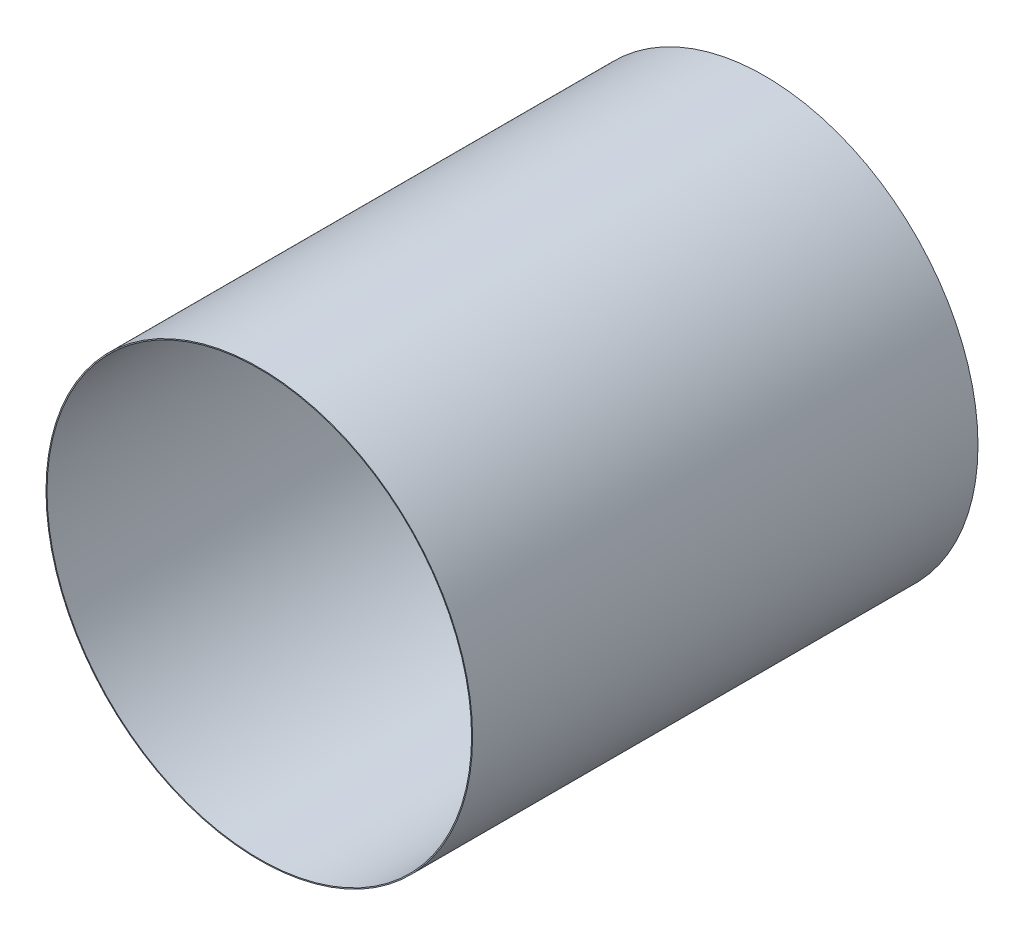
ISO-10303-21;
HEADER;
FILE_DESCRIPTION(('STEP AP214'),'2;1');
FILE_NAME('part.step','',(''),(''),'','','');
FILE_SCHEMA(('AUTOMOTIVE_DESIGN { 1 0 10303 214 1 1 1 1 }'));
ENDSEC;
DATA;
#1=APPLICATION_CONTEXT('core data for automotive mechanical design processes');
#2=APPLICATION_PROTOCOL_DEFINITION('international standard','automotive_design',2000,#1);
#3=PRODUCT_CONTEXT('',#1,'mechanical');
#4=PRODUCT('Part','Part','',(#3));
#5=PRODUCT_RELATED_PRODUCT_CATEGORY('part','',(#4));
#6=PRODUCT_DEFINITION_FORMATION('','',#4);
#7=PRODUCT_DEFINITION_CONTEXT('part definition',#1,'design');
#8=PRODUCT_DEFINITION('design','',#6,#7);
#9=PRODUCT_DEFINITION_SHAPE('','',#8);
#10=(LENGTH_UNIT() NAMED_UNIT(*) SI_UNIT(.MILLI.,.METRE.));
#11=(NAMED_UNIT(*) PLANE_ANGLE_UNIT() SI_UNIT($,.RADIAN.));
#12=(NAMED_UNIT(*) SI_UNIT($,.STERADIAN.) SOLID_ANGLE_UNIT());
#13=UNCERTAINTY_MEASURE_WITH_UNIT(LENGTH_MEASURE(1.E-05),#10,'distance_accuracy_value','');
#14=(GEOMETRIC_REPRESENTATION_CONTEXT(3) GLOBAL_UNCERTAINTY_ASSIGNED_CONTEXT((#13)) GLOBAL_UNIT_ASSIGNED_CONTEXT((#10,
#11,#12)) REPRESENTATION_CONTEXT('',''));
#15=CARTESIAN_POINT('',(0.,0.,0.));
#16=DIRECTION('',(0.,0.,1.));
#17=DIRECTION('',(1.,0.,0.));
#18=AXIS2_PLACEMENT_3D('',#15,#16,#17);
#19=CARTESIAN_POINT('',(0.,0.,25.));
#20=DIRECTION('',(0.,0.,1.));
#21=DIRECTION('',(1.,0.,0.));
#22=AXIS2_PLACEMENT_3D('',#19,#20,#21);
#23=PLANE('',#22);
#24=CARTESIAN_POINT('',(0.,0.,25.));
#25=DIRECTION('',(0.,0.,1.));
#26=DIRECTION('',(1.,0.,0.));
#27=AXIS2_PLACEMENT_3D('',#24,#25,#26);
#28=CIRCLE('',#27,10.55);
#29=CARTESIAN_POINT('',(10.55,0.,25.));
#30=VERTEX_POINT('',#29);
#31=EDGE_CURVE('E10',#30,#30,#28,.T.);
#32=ORIENTED_EDGE('',*,*,#31,.T.);
#33=EDGE_LOOP('',(#32));
#34=FACE_BOUND('',#33,.T.);
#35=CARTESIAN_POINT('',(0.,0.,25.));
#36=DIRECTION('',(0.,0.,1.));
#37=DIRECTION('',(1.,0.,0.));
#38=AXIS2_PLACEMENT_3D('',#35,#36,#37);
#39=CIRCLE('',#38,10.5);
#40=CARTESIAN_POINT('',(10.5,0.,25.));
#41=VERTEX_POINT('',#40);
#42=EDGE_CURVE('E42',#41,#41,#39,.T.);
#43=ORIENTED_EDGE('',*,*,#42,.F.);
#44=EDGE_LOOP('',(#43));
#45=FACE_BOUND('',#44,.T.);
#46=ADVANCED_FACE('F31',(#34,#45),#23,.T.);
#47=CARTESIAN_POINT('',(0.,0.,0.));
#48=DIRECTION('',(0.,0.,1.));
#49=DIRECTION('',(1.,0.,0.));
#50=AXIS2_PLACEMENT_3D('',#47,#48,#49);
#51=PLANE('',#50);
#52=CARTESIAN_POINT('',(0.,0.,0.));
#53=DIRECTION('',(0.,0.,1.));
#54=DIRECTION('',(1.,0.,0.));
#55=AXIS2_PLACEMENT_3D('',#52,#53,#54);
#56=CIRCLE('',#55,10.55);
#57=CARTESIAN_POINT('',(10.55,0.,0.));
#58=VERTEX_POINT('',#57);
#59=EDGE_CURVE('E35',#58,#58,#56,.T.);
#60=ORIENTED_EDGE('',*,*,#59,.F.);
#61=EDGE_LOOP('',(#60));
#62=FACE_BOUND('',#61,.T.);
#63=CARTESIAN_POINT('',(0.,0.,0.));
#64=DIRECTION('',(0.,0.,1.));
#65=DIRECTION('',(1.,0.,0.));
#66=AXIS2_PLACEMENT_3D('',#63,#64,#65);
#67=CIRCLE('',#66,10.5);
#68=CARTESIAN_POINT('',(10.5,0.,0.));
#69=VERTEX_POINT('',#68);
#70=EDGE_CURVE('E44',#69,#69,#67,.T.);
#71=ORIENTED_EDGE('',*,*,#70,.T.);
#72=EDGE_LOOP('',(#71));
#73=FACE_BOUND('',#72,.T.);
#74=ADVANCED_FACE('F54',(#62,#73),#51,.F.);
#75=CARTESIAN_POINT('',(0.,0.,25.));
#76=DIRECTION('',(0.,0.,-1.));
#77=DIRECTION('',(-1.,0.,0.));
#78=AXIS2_PLACEMENT_3D('',#75,#76,#77);
#79=CYLINDRICAL_SURFACE('',#78,10.55);
#80=ORIENTED_EDGE('',*,*,#31,.F.);
#81=EDGE_LOOP('',(#80));
#82=FACE_BOUND('',#81,.T.);
#83=ORIENTED_EDGE('',*,*,#59,.T.);
#84=EDGE_LOOP('',(#83));
#85=FACE_BOUND('',#84,.T.);
#86=ADVANCED_FACE('F33',(#82,#85),#79,.T.);
#87=CARTESIAN_POINT('',(0.,0.,25.));
#88=DIRECTION('',(0.,0.,-1.));
#89=DIRECTION('',(-1.,0.,0.));
#90=AXIS2_PLACEMENT_3D('',#87,#88,#89);
#91=CYLINDRICAL_SURFACE('',#90,10.5);
#92=ORIENTED_EDGE('',*,*,#42,.T.);
#93=EDGE_LOOP('',(#92));
#94=FACE_BOUND('',#93,.T.);
#95=ORIENTED_EDGE('',*,*,#70,.F.);
#96=EDGE_LOOP('',(#95));
#97=FACE_BOUND('',#96,.T.);
#98=ADVANCED_FACE('F50',(#94,#97),#91,.F.);
#99=CLOSED_SHELL('',(#46,#74,#86,#98));
#100=MANIFOLD_SOLID_BREP('B2',#99);
#101=ADVANCED_BREP_SHAPE_REPRESENTATION('',(#18,#100),#14);
#102=SHAPE_DEFINITION_REPRESENTATION(#9,#101);
ENDSEC;
END-ISO-10303-21;
